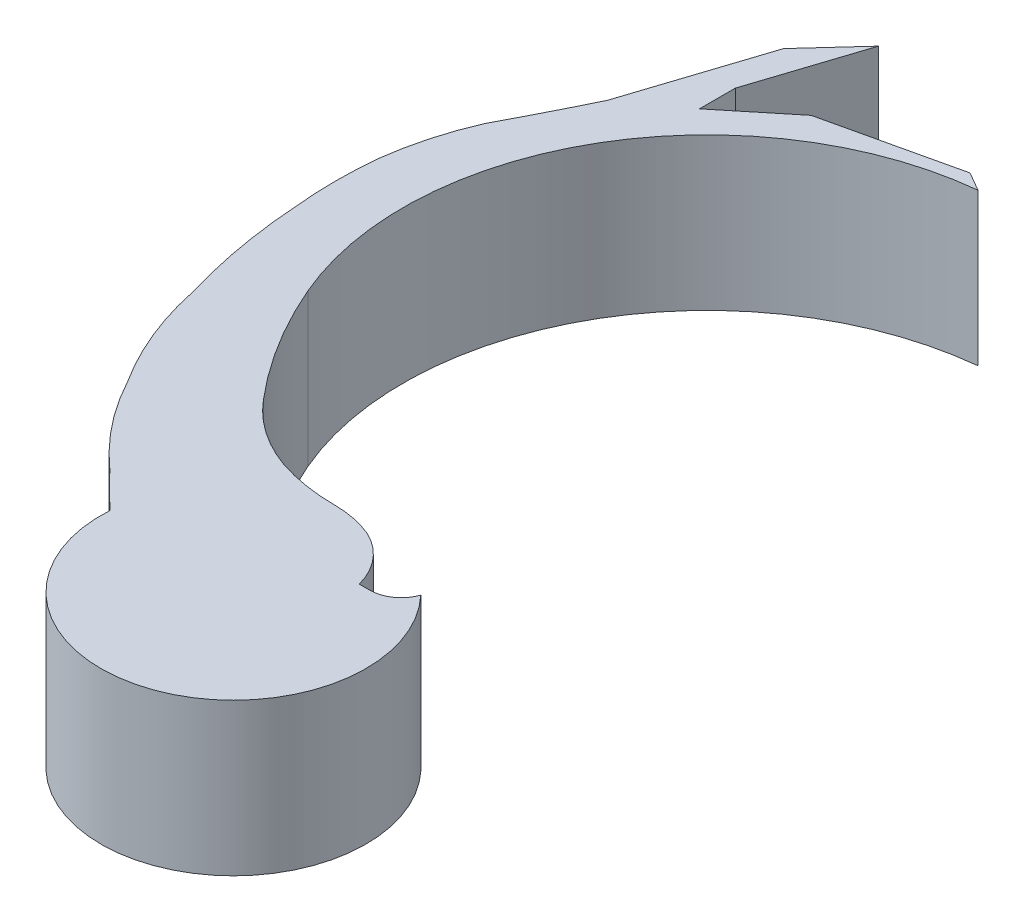
ISO-10303-21;
HEADER;
FILE_DESCRIPTION(('STEP AP214'),'2;1');
FILE_NAME('part.step','',(''),(''),'','','');
FILE_SCHEMA(('AUTOMOTIVE_DESIGN { 1 0 10303 214 1 1 1 1 }'));
ENDSEC;
DATA;
#1=APPLICATION_CONTEXT('core data for automotive mechanical design processes');
#2=APPLICATION_PROTOCOL_DEFINITION('international standard','automotive_design',2000,#1);
#3=PRODUCT_CONTEXT('',#1,'mechanical');
#4=PRODUCT('Part','Part','',(#3));
#5=PRODUCT_RELATED_PRODUCT_CATEGORY('part','',(#4));
#6=PRODUCT_DEFINITION_FORMATION('','',#4);
#7=PRODUCT_DEFINITION_CONTEXT('part definition',#1,'design');
#8=PRODUCT_DEFINITION('design','',#6,#7);
#9=PRODUCT_DEFINITION_SHAPE('','',#8);
#10=(LENGTH_UNIT() NAMED_UNIT(*) SI_UNIT(.MILLI.,.METRE.));
#11=(NAMED_UNIT(*) PLANE_ANGLE_UNIT() SI_UNIT($,.RADIAN.));
#12=(NAMED_UNIT(*) SI_UNIT($,.STERADIAN.) SOLID_ANGLE_UNIT());
#13=UNCERTAINTY_MEASURE_WITH_UNIT(LENGTH_MEASURE(1.E-05),#10,'distance_accuracy_value','');
#14=(GEOMETRIC_REPRESENTATION_CONTEXT(3) GLOBAL_UNCERTAINTY_ASSIGNED_CONTEXT((#13)) GLOBAL_UNIT_ASSIGNED_CONTEXT((#10,
#11,#12)) REPRESENTATION_CONTEXT('',''));
#15=CARTESIAN_POINT('',(0.,0.,0.));
#16=DIRECTION('',(0.,0.,1.));
#17=DIRECTION('',(1.,0.,0.));
#18=AXIS2_PLACEMENT_3D('',#15,#16,#17);
#19=CARTESIAN_POINT('',(-20.2142413349629,10.,0.));
#20=DIRECTION('',(1.,0.,0.));
#21=DIRECTION('',(0.,0.,-1.));
#22=AXIS2_PLACEMENT_3D('',#19,#20,#21);
#23=PLANE('',#22);
#24=DIRECTION('',(0.,0.,1.));
#25=VECTOR('',#24,1.);
#26=CARTESIAN_POINT('',(-20.2142413349629,0.,0.));
#27=LINE('',#26,#25);
#28=CARTESIAN_POINT('',(-20.2142413349629,0.,-18.5820088699334));
#29=VERTEX_POINT('',#28);
#30=CARTESIAN_POINT('',(-20.2142413349629,0.,-16.2231725935429));
#31=VERTEX_POINT('',#30);
#32=EDGE_CURVE('E216',#29,#31,#27,.T.);
#33=ORIENTED_EDGE('',*,*,#32,.F.);
#34=DIRECTION('',(0.,-1.,0.));
#35=VECTOR('',#34,1.);
#36=CARTESIAN_POINT('',(-20.2142413349629,10.,-18.5820088699334));
#37=LINE('',#36,#35);
#38=CARTESIAN_POINT('',(-20.2142413349629,10.,-18.5820088699334));
#39=VERTEX_POINT('',#38);
#40=EDGE_CURVE('E11',#39,#29,#37,.T.);
#41=ORIENTED_EDGE('',*,*,#40,.F.);
#42=DIRECTION('',(0.,0.,1.));
#43=VECTOR('',#42,1.);
#44=CARTESIAN_POINT('',(-20.2142413349629,10.,0.));
#45=LINE('',#44,#43);
#46=CARTESIAN_POINT('',(-20.2142413349629,10.,-16.2231725935429));
#47=VERTEX_POINT('',#46);
#48=EDGE_CURVE('E267',#39,#47,#45,.T.);
#49=ORIENTED_EDGE('',*,*,#48,.T.);
#50=DIRECTION('',(0.,-1.,0.));
#51=VECTOR('',#50,1.);
#52=CARTESIAN_POINT('',(-20.2142413349629,10.,-16.2231725935429));
#53=LINE('',#52,#51);
#54=EDGE_CURVE('E129',#47,#31,#53,.T.);
#55=ORIENTED_EDGE('',*,*,#54,.T.);
#56=EDGE_LOOP('',(#33,#41,#49,#55));
#57=FACE_BOUND('',#56,.T.);
#58=ADVANCED_FACE('F34',(#57),#23,.T.);
#59=CARTESIAN_POINT('',(-23.7471866779469,10.,-7.73368275087385));
#60=DIRECTION('',(0.9508473764207,0.,0.30965992112941));
#61=DIRECTION('',(0.30965992112941,0.,-0.9508473764207));
#62=AXIS2_PLACEMENT_3D('',#59,#60,#61);
#63=PLANE('',#62);
#64=DIRECTION('',(-0.30965992112941,0.,0.9508473764207));
#65=VECTOR('',#64,1.);
#66=CARTESIAN_POINT('',(-23.7471866779469,0.,-7.73368275087385));
#67=LINE('',#66,#65);
#68=CARTESIAN_POINT('',(-17.9037086364288,0.,-25.676772527182));
#69=VERTEX_POINT('',#68);
#70=EDGE_CURVE('E219',#69,#29,#67,.T.);
#71=ORIENTED_EDGE('',*,*,#70,.F.);
#72=DIRECTION('',(0.,-1.,0.));
#73=VECTOR('',#72,1.);
#74=CARTESIAN_POINT('',(-17.9037086364288,10.,-25.676772527182));
#75=LINE('',#74,#73);
#76=CARTESIAN_POINT('',(-17.9037086364288,10.,-25.676772527182));
#77=VERTEX_POINT('',#76);
#78=EDGE_CURVE('E42',#77,#69,#75,.T.);
#79=ORIENTED_EDGE('',*,*,#78,.F.);
#80=DIRECTION('',(-0.30965992112941,0.,0.9508473764207));
#81=VECTOR('',#80,1.);
#82=CARTESIAN_POINT('',(-23.7471866779469,10.,-7.73368275087385));
#83=LINE('',#82,#81);
#84=EDGE_CURVE('E333',#77,#39,#83,.T.);
#85=ORIENTED_EDGE('',*,*,#84,.T.);
#86=ORIENTED_EDGE('',*,*,#40,.T.);
#87=EDGE_LOOP('',(#71,#79,#85,#86));
#88=FACE_BOUND('',#87,.T.);
#89=ADVANCED_FACE('F332',(#88),#63,.T.);
#90=CARTESIAN_POINT('',(-22.5451132045827,10.,-20.5961675466554));
#91=DIRECTION('',(0.738297960081065,0.,0.674474700889617));
#92=DIRECTION('',(0.674474700889617,0.,-0.738297960081065));
#93=AXIS2_PLACEMENT_3D('',#90,#91,#92);
#94=PLANE('',#93);
#95=DIRECTION('',(-0.674474700889617,0.,0.738297960081065));
#96=VECTOR('',#95,1.);
#97=CARTESIAN_POINT('',(-22.5451132045827,0.,-20.5961675466554));
#98=LINE('',#97,#96);
#99=CARTESIAN_POINT('',(-20.8793273548735,0.,-22.4195810759546));
#100=VERTEX_POINT('',#99);
#101=EDGE_CURVE('E222',#69,#100,#98,.T.);
#102=ORIENTED_EDGE('',*,*,#101,.T.);
#103=DIRECTION('',(0.,-1.,0.));
#104=VECTOR('',#103,1.);
#105=CARTESIAN_POINT('',(-20.8793273548735,10.,-22.4195810759546));
#106=LINE('',#105,#104);
#107=CARTESIAN_POINT('',(-20.8793273548735,10.,-22.4195810759546));
#108=VERTEX_POINT('',#107);
#109=EDGE_CURVE('E316',#108,#100,#106,.T.);
#110=ORIENTED_EDGE('',*,*,#109,.F.);
#111=DIRECTION('',(-0.674474700889617,0.,0.738297960081065));
#112=VECTOR('',#111,1.);
#113=CARTESIAN_POINT('',(-22.5451132045827,10.,-20.5961675466554));
#114=LINE('',#113,#112);
#115=EDGE_CURVE('E323',#77,#108,#114,.T.);
#116=ORIENTED_EDGE('',*,*,#115,.F.);
#117=ORIENTED_EDGE('',*,*,#78,.T.);
#118=EDGE_LOOP('',(#102,#110,#116,#117));
#119=FACE_BOUND('',#118,.T.);
#120=ADVANCED_FACE('F321',(#119),#94,.F.);
#121=CARTESIAN_POINT('',(-25.4784302516431,10.,-8.29749221365493));
#122=DIRECTION('',(0.9508473764207,0.,0.309659921129409));
#123=DIRECTION('',(0.309659921129409,0.,-0.9508473764207));
#124=AXIS2_PLACEMENT_3D('',#121,#122,#123);
#125=PLANE('',#124);
#126=DIRECTION('',(-0.309659921129409,0.,0.9508473764207));
#127=VECTOR('',#126,1.);
#128=CARTESIAN_POINT('',(-25.4784302516431,0.,-8.29749221365493));
#129=LINE('',#128,#127);
#130=CARTESIAN_POINT('',(-23.7260144435207,0.,-13.678492013287));
#131=VERTEX_POINT('',#130);
#132=EDGE_CURVE('E224',#100,#131,#129,.T.);
#133=ORIENTED_EDGE('',*,*,#132,.T.);
#134=DIRECTION('',(0.,-1.,0.));
#135=VECTOR('',#134,1.);
#136=CARTESIAN_POINT('',(-23.7260144435207,10.,-13.678492013287));
#137=LINE('',#136,#135);
#138=CARTESIAN_POINT('',(-23.7260144435207,10.,-13.678492013287));
#139=VERTEX_POINT('',#138);
#140=EDGE_CURVE('E313',#139,#131,#137,.T.);
#141=ORIENTED_EDGE('',*,*,#140,.F.);
#142=DIRECTION('',(-0.309659921129409,0.,0.9508473764207));
#143=VECTOR('',#142,1.);
#144=CARTESIAN_POINT('',(-25.4784302516431,10.,-8.29749221365493));
#145=LINE('',#144,#143);
#146=EDGE_CURVE('E339',#108,#139,#145,.T.);
#147=ORIENTED_EDGE('',*,*,#146,.F.);
#148=ORIENTED_EDGE('',*,*,#109,.T.);
#149=EDGE_LOOP('',(#133,#141,#147,#148));
#150=FACE_BOUND('',#149,.T.);
#151=ADVANCED_FACE('F449',(#150),#125,.F.);
#152=CARTESIAN_POINT('',(-176.392216070516,10.,-87.6034124748396));
#153=DIRECTION('',(0.,-1.,0.));
#154=DIRECTION('',(0.,0.,-1.));
#155=AXIS2_PLACEMENT_3D('',#152,#153,#154);
#156=CYLINDRICAL_SURFACE('',#155,169.622707750057);
#157=CARTESIAN_POINT('',(-176.392216070516,0.,-87.6034124748396));
#158=DIRECTION('',(0.,1.,0.));
#159=DIRECTION('',(0.,0.,1.));
#160=AXIS2_PLACEMENT_3D('',#157,#158,#159);
#161=CIRCLE('',#160,169.622707750057);
#162=CARTESIAN_POINT('',(-26.4444092567069,0.,-8.30953997393402));
#163=VERTEX_POINT('',#162);
#164=EDGE_CURVE('E226',#131,#163,#161,.F.);
#165=ORIENTED_EDGE('',*,*,#164,.T.);
#166=DIRECTION('',(0.,-1.,0.));
#167=VECTOR('',#166,1.);
#168=CARTESIAN_POINT('',(-26.4444092567069,10.,-8.30953997393402));
#169=LINE('',#168,#167);
#170=CARTESIAN_POINT('',(-26.4444092567069,10.,-8.30953997393402));
#171=VERTEX_POINT('',#170);
#172=EDGE_CURVE('E310',#171,#163,#169,.T.);
#173=ORIENTED_EDGE('',*,*,#172,.F.);
#174=CARTESIAN_POINT('',(-176.392216070516,10.,-87.6034124748396));
#175=DIRECTION('',(0.,1.,0.));
#176=DIRECTION('',(0.,0.,1.));
#177=AXIS2_PLACEMENT_3D('',#174,#175,#176);
#178=CIRCLE('',#177,169.622707750057);
#179=EDGE_CURVE('E341',#139,#171,#178,.F.);
#180=ORIENTED_EDGE('',*,*,#179,.F.);
#181=ORIENTED_EDGE('',*,*,#140,.T.);
#182=EDGE_LOOP('',(#165,#173,#180,#181));
#183=FACE_BOUND('',#182,.T.);
#184=ADVANCED_FACE('F445',(#183),#156,.F.);
#185=CARTESIAN_POINT('',(-7.95665330887578,10.,-0.323804662988942));
#186=DIRECTION('',(0.,-1.,0.));
#187=DIRECTION('',(0.,0.,-1.));
#188=AXIS2_PLACEMENT_3D('',#185,#186,#187);
#189=CYLINDRICAL_SURFACE('',#188,20.1387459501092);
#190=CARTESIAN_POINT('',(-7.95665330887578,0.,-0.323804662988942));
#191=DIRECTION('',(0.,1.,0.));
#192=DIRECTION('',(0.,0.,1.));
#193=AXIS2_PLACEMENT_3D('',#190,#191,#192);
#194=CIRCLE('',#193,20.1387459501092);
#195=CARTESIAN_POINT('',(-27.9369455661077,0.,-2.84511578195853));
#196=VERTEX_POINT('',#195);
#197=EDGE_CURVE('E228',#163,#196,#194,.T.);
#198=ORIENTED_EDGE('',*,*,#197,.T.);
#199=DIRECTION('',(0.,-1.,0.));
#200=VECTOR('',#199,1.);
#201=CARTESIAN_POINT('',(-27.9369455661077,10.,-2.84511578195853));
#202=LINE('',#201,#200);
#203=CARTESIAN_POINT('',(-27.9369455661077,10.,-2.84511578195853));
#204=VERTEX_POINT('',#203);
#205=EDGE_CURVE('E307',#204,#196,#202,.T.);
#206=ORIENTED_EDGE('',*,*,#205,.F.);
#207=CARTESIAN_POINT('',(-7.95665330887578,10.,-0.323804662988942));
#208=DIRECTION('',(0.,1.,0.));
#209=DIRECTION('',(0.,0.,1.));
#210=AXIS2_PLACEMENT_3D('',#207,#208,#209);
#211=CIRCLE('',#210,20.1387459501092);
#212=EDGE_CURVE('E343',#171,#204,#211,.T.);
#213=ORIENTED_EDGE('',*,*,#212,.F.);
#214=ORIENTED_EDGE('',*,*,#172,.T.);
#215=EDGE_LOOP('',(#198,#206,#213,#214));
#216=FACE_BOUND('',#215,.T.);
#217=ADVANCED_FACE('F440',(#216),#189,.T.);
#218=CARTESIAN_POINT('',(-0.916574408994741,10.,-0.180490640112039));
#219=DIRECTION('',(0.,-1.,0.));
#220=DIRECTION('',(0.,0.,-1.));
#221=AXIS2_PLACEMENT_3D('',#218,#219,#220);
#222=CYLINDRICAL_SURFACE('',#221,27.1514398258122);
#223=CARTESIAN_POINT('',(-0.916574408994741,0.,-0.180490640112039));
#224=DIRECTION('',(0.,1.,0.));
#225=DIRECTION('',(0.,0.,1.));
#226=AXIS2_PLACEMENT_3D('',#223,#224,#225);
#227=CIRCLE('',#226,27.1514398258122);
#228=CARTESIAN_POINT('',(-27.9369455661077,0.,2.48413450173445));
#229=VERTEX_POINT('',#228);
#230=EDGE_CURVE('E230',#196,#229,#227,.T.);
#231=ORIENTED_EDGE('',*,*,#230,.T.);
#232=DIRECTION('',(0.,-1.,0.));
#233=VECTOR('',#232,1.);
#234=CARTESIAN_POINT('',(-27.9369455661077,10.,2.48413450173445));
#235=LINE('',#234,#233);
#236=CARTESIAN_POINT('',(-27.9369455661077,10.,2.48413450173445));
#237=VERTEX_POINT('',#236);
#238=EDGE_CURVE('E304',#237,#229,#235,.T.);
#239=ORIENTED_EDGE('',*,*,#238,.F.);
#240=CARTESIAN_POINT('',(-0.916574408994741,10.,-0.180490640112039));
#241=DIRECTION('',(0.,1.,0.));
#242=DIRECTION('',(0.,0.,1.));
#243=AXIS2_PLACEMENT_3D('',#240,#241,#242);
#244=CIRCLE('',#243,27.1514398258122);
#245=EDGE_CURVE('E345',#204,#237,#244,.T.);
#246=ORIENTED_EDGE('',*,*,#245,.F.);
#247=ORIENTED_EDGE('',*,*,#205,.T.);
#248=EDGE_LOOP('',(#231,#239,#246,#247));
#249=FACE_BOUND('',#248,.T.);
#250=ADVANCED_FACE('F436',(#249),#222,.T.);
#251=CARTESIAN_POINT('',(10.0269760816482,10.,0.0435951776764512));
#252=DIRECTION('',(0.,-1.,0.));
#253=DIRECTION('',(0.,0.,-1.));
#254=AXIS2_PLACEMENT_3D('',#251,#252,#253);
#255=CYLINDRICAL_SURFACE('',#254,38.0422867223991);
#256=CARTESIAN_POINT('',(10.0269760816482,0.,0.0435951776764512));
#257=DIRECTION('',(0.,1.,0.));
#258=DIRECTION('',(0.,0.,1.));
#259=AXIS2_PLACEMENT_3D('',#256,#257,#258);
#260=CIRCLE('',#259,38.0422867223991);
#261=CARTESIAN_POINT('',(-26.4444092567069,0.,10.8627277940389));
#262=VERTEX_POINT('',#261);
#263=EDGE_CURVE('E232',#229,#262,#260,.T.);
#264=ORIENTED_EDGE('',*,*,#263,.T.);
#265=DIRECTION('',(0.,-1.,0.));
#266=VECTOR('',#265,1.);
#267=CARTESIAN_POINT('',(-26.4444092567069,10.,10.8627277940389));
#268=LINE('',#267,#266);
#269=CARTESIAN_POINT('',(-26.4444092567069,10.,10.8627277940389));
#270=VERTEX_POINT('',#269);
#271=EDGE_CURVE('E301',#270,#262,#268,.T.);
#272=ORIENTED_EDGE('',*,*,#271,.F.);
#273=CARTESIAN_POINT('',(10.0269760816482,10.,0.0435951776764512));
#274=DIRECTION('',(0.,1.,0.));
#275=DIRECTION('',(0.,0.,1.));
#276=AXIS2_PLACEMENT_3D('',#273,#274,#275);
#277=CIRCLE('',#276,38.0422867223991);
#278=EDGE_CURVE('E347',#237,#270,#277,.T.);
#279=ORIENTED_EDGE('',*,*,#278,.F.);
#280=ORIENTED_EDGE('',*,*,#238,.T.);
#281=EDGE_LOOP('',(#264,#272,#279,#280));
#282=FACE_BOUND('',#281,.T.);
#283=ADVANCED_FACE('F432',(#282),#255,.T.);
#284=CARTESIAN_POINT('',(-5.33895266715763,10.,6.45705183034006));
#285=DIRECTION('',(0.,-1.,0.));
#286=DIRECTION('',(0.,0.,-1.));
#287=AXIS2_PLACEMENT_3D('',#284,#285,#286);
#288=CYLINDRICAL_SURFACE('',#287,21.5603867903724);
#289=CARTESIAN_POINT('',(-5.33895266715763,0.,6.45705183034006));
#290=DIRECTION('',(0.,1.,0.));
#291=DIRECTION('',(0.,0.,1.));
#292=AXIS2_PLACEMENT_3D('',#289,#290,#291);
#293=CIRCLE('',#292,21.5603867903724);
#294=CARTESIAN_POINT('',(-23.4883748387578,0.,18.0952971185049));
#295=VERTEX_POINT('',#294);
#296=EDGE_CURVE('E234',#262,#295,#293,.T.);
#297=ORIENTED_EDGE('',*,*,#296,.T.);
#298=DIRECTION('',(0.,-1.,0.));
#299=VECTOR('',#298,1.);
#300=CARTESIAN_POINT('',(-23.4883748387578,10.,18.0952971185049));
#301=LINE('',#300,#299);
#302=CARTESIAN_POINT('',(-23.4883748387578,10.,18.0952971185049));
#303=VERTEX_POINT('',#302);
#304=EDGE_CURVE('E298',#303,#295,#301,.T.);
#305=ORIENTED_EDGE('',*,*,#304,.F.);
#306=CARTESIAN_POINT('',(-5.33895266715763,10.,6.45705183034006));
#307=DIRECTION('',(0.,1.,0.));
#308=DIRECTION('',(0.,0.,1.));
#309=AXIS2_PLACEMENT_3D('',#306,#307,#308);
#310=CIRCLE('',#309,21.5603867903724);
#311=EDGE_CURVE('E349',#270,#303,#310,.T.);
#312=ORIENTED_EDGE('',*,*,#311,.F.);
#313=ORIENTED_EDGE('',*,*,#271,.T.);
#314=EDGE_LOOP('',(#297,#305,#312,#313));
#315=FACE_BOUND('',#314,.T.);
#316=ADVANCED_FACE('F427',(#315),#288,.T.);
#317=CARTESIAN_POINT('',(-5.56875548128325,10.,8.49444290633343));
#318=DIRECTION('',(0.,-1.,0.));
#319=DIRECTION('',(0.,0.,-1.));
#320=AXIS2_PLACEMENT_3D('',#317,#318,#319);
#321=CYLINDRICAL_SURFACE('',#320,20.3295144929766);
#322=CARTESIAN_POINT('',(-5.56875548128325,0.,8.49444290633343));
#323=DIRECTION('',(0.,1.,0.));
#324=DIRECTION('',(0.,0.,1.));
#325=AXIS2_PLACEMENT_3D('',#322,#323,#324);
#326=CIRCLE('',#325,20.3295144929766);
#327=CARTESIAN_POINT('',(-19.0281085745464,0.,23.7304192068865));
#328=VERTEX_POINT('',#327);
#329=EDGE_CURVE('E236',#295,#328,#326,.T.);
#330=ORIENTED_EDGE('',*,*,#329,.T.);
#331=DIRECTION('',(0.,-1.,0.));
#332=VECTOR('',#331,1.);
#333=CARTESIAN_POINT('',(-19.0281085745464,10.,23.7304192068865));
#334=LINE('',#333,#332);
#335=CARTESIAN_POINT('',(-19.0281085745464,10.,23.7304192068865));
#336=VERTEX_POINT('',#335);
#337=EDGE_CURVE('E295',#336,#328,#334,.T.);
#338=ORIENTED_EDGE('',*,*,#337,.F.);
#339=CARTESIAN_POINT('',(-5.56875548128325,10.,8.49444290633343));
#340=DIRECTION('',(0.,1.,0.));
#341=DIRECTION('',(0.,0.,1.));
#342=AXIS2_PLACEMENT_3D('',#339,#340,#341);
#343=CIRCLE('',#342,20.3295144929766);
#344=EDGE_CURVE('E351',#303,#336,#343,.T.);
#345=ORIENTED_EDGE('',*,*,#344,.F.);
#346=ORIENTED_EDGE('',*,*,#304,.T.);
#347=EDGE_LOOP('',(#330,#338,#345,#346));
#348=FACE_BOUND('',#347,.T.);
#349=ADVANCED_FACE('F421',(#348),#321,.T.);
#350=CARTESIAN_POINT('',(23.0713592637592,10.,-16.3305079808861));
#351=DIRECTION('',(0.,-1.,0.));
#352=DIRECTION('',(0.,0.,-1.));
#353=AXIS2_PLACEMENT_3D('',#350,#351,#352);
#354=CYLINDRICAL_SURFACE('',#353,58.1140523403122);
#355=CARTESIAN_POINT('',(23.0713592637592,0.,-16.3305079808861));
#356=DIRECTION('',(0.,1.,0.));
#357=DIRECTION('',(0.,0.,1.));
#358=AXIS2_PLACEMENT_3D('',#355,#356,#357);
#359=CIRCLE('',#358,58.1140523403122);
#360=CARTESIAN_POINT('',(-16.7188963438803,0.,26.0248770143097));
#361=VERTEX_POINT('',#360);
#362=EDGE_CURVE('E238',#328,#361,#359,.T.);
#363=ORIENTED_EDGE('',*,*,#362,.T.);
#364=DIRECTION('',(0.,-1.,0.));
#365=VECTOR('',#364,1.);
#366=CARTESIAN_POINT('',(-16.7188963438803,10.,26.0248770143097));
#367=LINE('',#366,#365);
#368=CARTESIAN_POINT('',(-16.7188963438803,10.,26.0248770143097));
#369=VERTEX_POINT('',#368);
#370=EDGE_CURVE('E292',#369,#361,#367,.T.);
#371=ORIENTED_EDGE('',*,*,#370,.F.);
#372=CARTESIAN_POINT('',(23.0713592637592,10.,-16.3305079808861));
#373=DIRECTION('',(0.,1.,0.));
#374=DIRECTION('',(0.,0.,1.));
#375=AXIS2_PLACEMENT_3D('',#372,#373,#374);
#376=CIRCLE('',#375,58.1140523403122);
#377=EDGE_CURVE('E353',#336,#369,#376,.T.);
#378=ORIENTED_EDGE('',*,*,#377,.F.);
#379=ORIENTED_EDGE('',*,*,#337,.T.);
#380=EDGE_LOOP('',(#363,#371,#378,#379));
#381=FACE_BOUND('',#380,.T.);
#382=ADVANCED_FACE('F417',(#381),#354,.T.);
#383=CARTESIAN_POINT('',(-8.02083751157961,10.,26.6117701255922));
#384=DIRECTION('',(0.,-1.,0.));
#385=DIRECTION('',(0.,0.,-1.));
#386=AXIS2_PLACEMENT_3D('',#383,#384,#385);
#387=CYLINDRICAL_SURFACE('',#386,8.71783637000804);
#388=CARTESIAN_POINT('',(-8.02083751157961,0.,26.6117701255922));
#389=DIRECTION('',(0.,1.,0.));
#390=DIRECTION('',(0.,0.,1.));
#391=AXIS2_PLACEMENT_3D('',#388,#389,#390);
#392=CIRCLE('',#391,8.71783637000804);
#393=CARTESIAN_POINT('',(-1.68257798066413,0.,20.6261927020687));
#394=VERTEX_POINT('',#393);
#395=EDGE_CURVE('E240',#361,#394,#392,.T.);
#396=ORIENTED_EDGE('',*,*,#395,.T.);
#397=DIRECTION('',(0.,-1.,0.));
#398=VECTOR('',#397,1.);
#399=CARTESIAN_POINT('',(-1.68257798066413,10.,20.6261927020687));
#400=LINE('',#399,#398);
#401=CARTESIAN_POINT('',(-1.68257798066413,10.,20.6261927020687));
#402=VERTEX_POINT('',#401);
#403=EDGE_CURVE('E290',#402,#394,#400,.T.);
#404=ORIENTED_EDGE('',*,*,#403,.F.);
#405=CARTESIAN_POINT('',(-8.02083751157961,10.,26.6117701255922));
#406=DIRECTION('',(0.,1.,0.));
#407=DIRECTION('',(0.,0.,1.));
#408=AXIS2_PLACEMENT_3D('',#405,#406,#407);
#409=CIRCLE('',#408,8.71783637000804);
#410=EDGE_CURVE('E355',#369,#402,#409,.T.);
#411=ORIENTED_EDGE('',*,*,#410,.F.);
#412=ORIENTED_EDGE('',*,*,#370,.T.);
#413=EDGE_LOOP('',(#396,#404,#411,#412));
#414=FACE_BOUND('',#413,.T.);
#415=ADVANCED_FACE('F412',(#414),#387,.T.);
#416=CARTESIAN_POINT('',(-3.64579816787088,10.,19.9478915167739));
#417=DIRECTION('',(0.,-1.,0.));
#418=DIRECTION('',(0.,0.,-1.));
#419=AXIS2_PLACEMENT_3D('',#416,#417,#418);
#420=CYLINDRICAL_SURFACE('',#419,2.07709556867959);
#421=CARTESIAN_POINT('',(-3.64579816787088,0.,19.9478915167739));
#422=DIRECTION('',(0.,1.,0.));
#423=DIRECTION('',(0.,0.,1.));
#424=AXIS2_PLACEMENT_3D('',#421,#422,#423);
#425=CIRCLE('',#424,2.07709556867959);
#426=CARTESIAN_POINT('',(-3.64579816787088,0.,22.0249870854535));
#427=VERTEX_POINT('',#426);
#428=EDGE_CURVE('E243',#427,#394,#425,.T.);
#429=ORIENTED_EDGE('',*,*,#428,.F.);
#430=DIRECTION('',(0.,-1.,0.));
#431=VECTOR('',#430,1.);
#432=CARTESIAN_POINT('',(-3.64579816787088,10.,22.0249870854535));
#433=LINE('',#432,#431);
#434=CARTESIAN_POINT('',(-3.64579816787088,10.,22.0249870854535));
#435=VERTEX_POINT('',#434);
#436=EDGE_CURVE('E288',#435,#427,#433,.T.);
#437=ORIENTED_EDGE('',*,*,#436,.F.);
#438=CARTESIAN_POINT('',(-3.64579816787088,10.,19.9478915167739));
#439=DIRECTION('',(0.,1.,0.));
#440=DIRECTION('',(0.,0.,1.));
#441=AXIS2_PLACEMENT_3D('',#438,#439,#440);
#442=CIRCLE('',#441,2.07709556867959);
#443=EDGE_CURVE('E357',#435,#402,#442,.T.);
#444=ORIENTED_EDGE('',*,*,#443,.T.);
#445=ORIENTED_EDGE('',*,*,#403,.T.);
#446=EDGE_LOOP('',(#429,#437,#444,#445));
#447=FACE_BOUND('',#446,.T.);
#448=ADVANCED_FACE('F406',(#447),#420,.F.);
#449=CARTESIAN_POINT('',(0.,10.,22.0249870854535));
#450=DIRECTION('',(0.,0.,-1.));
#451=DIRECTION('',(-1.,0.,0.));
#452=AXIS2_PLACEMENT_3D('',#449,#450,#451);
#453=PLANE('',#452);
#454=DIRECTION('',(1.,0.,0.));
#455=VECTOR('',#454,1.);
#456=CARTESIAN_POINT('',(0.,0.,22.0249870854535));
#457=LINE('',#456,#455);
#458=CARTESIAN_POINT('',(-4.33019955839973,0.,22.0249870854535));
#459=VERTEX_POINT('',#458);
#460=EDGE_CURVE('E246',#459,#427,#457,.T.);
#461=ORIENTED_EDGE('',*,*,#460,.F.);
#462=DIRECTION('',(0.,-1.,0.));
#463=VECTOR('',#462,1.);
#464=CARTESIAN_POINT('',(-4.33019955839973,10.,22.0249870854535));
#465=LINE('',#464,#463);
#466=CARTESIAN_POINT('',(-4.33019955839973,10.,22.0249870854535));
#467=VERTEX_POINT('',#466);
#468=EDGE_CURVE('E286',#467,#459,#465,.T.);
#469=ORIENTED_EDGE('',*,*,#468,.F.);
#470=DIRECTION('',(1.,0.,0.));
#471=VECTOR('',#470,1.);
#472=CARTESIAN_POINT('',(0.,10.,22.0249870854535));
#473=LINE('',#472,#471);
#474=EDGE_CURVE('E360',#467,#435,#473,.T.);
#475=ORIENTED_EDGE('',*,*,#474,.T.);
#476=ORIENTED_EDGE('',*,*,#436,.T.);
#477=EDGE_LOOP('',(#461,#469,#475,#476));
#478=FACE_BOUND('',#477,.T.);
#479=ADVANCED_FACE('F400',(#478),#453,.T.);
#480=CARTESIAN_POINT('',(-9.04253642160193,10.,23.2869671122719));
#481=DIRECTION('',(0.,-1.,0.));
#482=DIRECTION('',(0.,0.,-1.));
#483=AXIS2_PLACEMENT_3D('',#480,#481,#482);
#484=CYLINDRICAL_SURFACE('',#483,4.8783923889313);
#485=CARTESIAN_POINT('',(-9.04253642160193,0.,23.2869671122719));
#486=DIRECTION('',(0.,1.,0.));
#487=DIRECTION('',(0.,0.,1.));
#488=AXIS2_PLACEMENT_3D('',#485,#486,#487);
#489=CIRCLE('',#488,4.8783923889313);
#490=CARTESIAN_POINT('',(-6.95849038282123,0.,18.8761322243368));
#491=VERTEX_POINT('',#490);
#492=EDGE_CURVE('E249',#459,#491,#489,.T.);
#493=ORIENTED_EDGE('',*,*,#492,.T.);
#494=DIRECTION('',(0.,-1.,0.));
#495=VECTOR('',#494,1.);
#496=CARTESIAN_POINT('',(-6.95849038282123,10.,18.8761322243368));
#497=LINE('',#496,#495);
#498=CARTESIAN_POINT('',(-6.95849038282123,10.,18.8761322243368));
#499=VERTEX_POINT('',#498);
#500=EDGE_CURVE('E283',#499,#491,#497,.T.);
#501=ORIENTED_EDGE('',*,*,#500,.F.);
#502=CARTESIAN_POINT('',(-9.04253642160193,10.,23.2869671122719));
#503=DIRECTION('',(0.,1.,0.));
#504=DIRECTION('',(0.,0.,1.));
#505=AXIS2_PLACEMENT_3D('',#502,#503,#504);
#506=CIRCLE('',#505,4.8783923889313);
#507=EDGE_CURVE('E363',#467,#499,#506,.T.);
#508=ORIENTED_EDGE('',*,*,#507,.F.);
#509=ORIENTED_EDGE('',*,*,#468,.T.);
#510=EDGE_LOOP('',(#493,#501,#508,#509));
#511=FACE_BOUND('',#510,.T.);
#512=ADVANCED_FACE('F450',(#511),#484,.T.);
#513=CARTESIAN_POINT('',(-9.68977642554818,10.,25.4216520417061));
#514=DIRECTION('',(0.,-1.,0.));
#515=DIRECTION('',(0.,0.,-1.));
#516=AXIS2_PLACEMENT_3D('',#513,#514,#515);
#517=CYLINDRICAL_SURFACE('',#516,7.09251387920879);
#518=CARTESIAN_POINT('',(-9.68977642554818,0.,25.4216520417061));
#519=DIRECTION('',(0.,1.,0.));
#520=DIRECTION('',(0.,0.,1.));
#521=AXIS2_PLACEMENT_3D('',#518,#519,#520);
#522=CIRCLE('',#521,7.09251387920879);
#523=CARTESIAN_POINT('',(-9.67568618032591,0.,18.3291521586071));
#524=VERTEX_POINT('',#523);
#525=EDGE_CURVE('E251',#491,#524,#522,.T.);
#526=ORIENTED_EDGE('',*,*,#525,.T.);
#527=DIRECTION('',(0.,-1.,0.));
#528=VECTOR('',#527,1.);
#529=CARTESIAN_POINT('',(-9.67568618032591,10.,18.3291521586071));
#530=LINE('',#529,#528);
#531=CARTESIAN_POINT('',(-9.67568618032591,10.,18.3291521586071));
#532=VERTEX_POINT('',#531);
#533=EDGE_CURVE('E280',#532,#524,#530,.T.);
#534=ORIENTED_EDGE('',*,*,#533,.F.);
#535=CARTESIAN_POINT('',(-9.68977642554818,10.,25.4216520417061));
#536=DIRECTION('',(0.,1.,0.));
#537=DIRECTION('',(0.,0.,1.));
#538=AXIS2_PLACEMENT_3D('',#535,#536,#537);
#539=CIRCLE('',#538,7.09251387920879);
#540=EDGE_CURVE('E365',#499,#532,#539,.T.);
#541=ORIENTED_EDGE('',*,*,#540,.F.);
#542=ORIENTED_EDGE('',*,*,#500,.T.);
#543=EDGE_LOOP('',(#526,#534,#541,#542));
#544=FACE_BOUND('',#543,.T.);
#545=ADVANCED_FACE('F394',(#544),#517,.T.);
#546=CARTESIAN_POINT('',(-9.65043153925733,10.,5.6169150043886));
#547=DIRECTION('',(0.,-1.,0.));
#548=DIRECTION('',(0.,0.,-1.));
#549=AXIS2_PLACEMENT_3D('',#546,#547,#548);
#550=CYLINDRICAL_SURFACE('',#549,12.7122622401361);
#551=CARTESIAN_POINT('',(-9.65043153925733,0.,5.6169150043886));
#552=DIRECTION('',(0.,1.,0.));
#553=DIRECTION('',(0.,0.,1.));
#554=AXIS2_PLACEMENT_3D('',#551,#552,#553);
#555=CIRCLE('',#554,12.7122622401361);
#556=CARTESIAN_POINT('',(-13.5956173911468,0.,17.7014969109355));
#557=VERTEX_POINT('',#556);
#558=EDGE_CURVE('E253',#524,#557,#555,.F.);
#559=ORIENTED_EDGE('',*,*,#558,.T.);
#560=DIRECTION('',(0.,-1.,0.));
#561=VECTOR('',#560,1.);
#562=CARTESIAN_POINT('',(-13.5956173911468,10.,17.7014969109355));
#563=LINE('',#562,#561);
#564=CARTESIAN_POINT('',(-13.5956173911468,10.,17.7014969109355));
#565=VERTEX_POINT('',#564);
#566=EDGE_CURVE('E277',#565,#557,#563,.T.);
#567=ORIENTED_EDGE('',*,*,#566,.F.);
#568=CARTESIAN_POINT('',(-9.65043153925733,10.,5.6169150043886));
#569=DIRECTION('',(0.,1.,0.));
#570=DIRECTION('',(0.,0.,1.));
#571=AXIS2_PLACEMENT_3D('',#568,#569,#570);
#572=CIRCLE('',#571,12.7122622401361);
#573=EDGE_CURVE('E367',#532,#565,#572,.F.);
#574=ORIENTED_EDGE('',*,*,#573,.F.);
#575=ORIENTED_EDGE('',*,*,#533,.T.);
#576=EDGE_LOOP('',(#559,#567,#574,#575));
#577=FACE_BOUND('',#576,.T.);
#578=ADVANCED_FACE('F390',(#577),#550,.F.);
#579=CARTESIAN_POINT('',(-10.3234413087134,10.,8.25695031631017));
#580=DIRECTION('',(0.,-1.,0.));
#581=DIRECTION('',(0.,0.,-1.));
#582=AXIS2_PLACEMENT_3D('',#579,#580,#581);
#583=CYLINDRICAL_SURFACE('',#582,9.99532874359308);
#584=CARTESIAN_POINT('',(-10.3234413087134,0.,8.25695031631017));
#585=DIRECTION('',(0.,1.,0.));
#586=DIRECTION('',(0.,0.,1.));
#587=AXIS2_PLACEMENT_3D('',#584,#585,#586);
#588=CIRCLE('',#587,9.99532874359308);
#589=CARTESIAN_POINT('',(-18.0103683454697,0.,14.6458273243676));
#590=VERTEX_POINT('',#589);
#591=EDGE_CURVE('E255',#557,#590,#588,.F.);
#592=ORIENTED_EDGE('',*,*,#591,.T.);
#593=DIRECTION('',(0.,-1.,0.));
#594=VECTOR('',#593,1.);
#595=CARTESIAN_POINT('',(-18.0103683454697,10.,14.6458273243676));
#596=LINE('',#595,#594);
#597=CARTESIAN_POINT('',(-18.0103683454697,10.,14.6458273243676));
#598=VERTEX_POINT('',#597);
#599=EDGE_CURVE('E274',#598,#590,#596,.T.);
#600=ORIENTED_EDGE('',*,*,#599,.F.);
#601=CARTESIAN_POINT('',(-10.3234413087134,10.,8.25695031631017));
#602=DIRECTION('',(0.,1.,0.));
#603=DIRECTION('',(0.,0.,1.));
#604=AXIS2_PLACEMENT_3D('',#601,#602,#603);
#605=CIRCLE('',#604,9.99532874359308);
#606=EDGE_CURVE('E369',#565,#598,#605,.F.);
#607=ORIENTED_EDGE('',*,*,#606,.F.);
#608=ORIENTED_EDGE('',*,*,#566,.T.);
#609=EDGE_LOOP('',(#592,#600,#607,#608));
#610=FACE_BOUND('',#609,.T.);
#611=ADVANCED_FACE('F386',(#610),#583,.F.);
#612=CARTESIAN_POINT('',(5.13122081313294,10.,-4.91362981829786));
#613=DIRECTION('',(0.,-1.,0.));
#614=DIRECTION('',(0.,0.,-1.));
#615=AXIS2_PLACEMENT_3D('',#612,#613,#614);
#616=CYLINDRICAL_SURFACE('',#615,30.3002559807887);
#617=CARTESIAN_POINT('',(5.13122081313294,0.,-4.91362981829786));
#618=DIRECTION('',(0.,1.,0.));
#619=DIRECTION('',(0.,0.,1.));
#620=AXIS2_PLACEMENT_3D('',#617,#618,#619);
#621=CIRCLE('',#620,30.3002559807887);
#622=CARTESIAN_POINT('',(-22.7225692599108,0.,7.01414830959043));
#623=VERTEX_POINT('',#622);
#624=EDGE_CURVE('E257',#590,#623,#621,.F.);
#625=ORIENTED_EDGE('',*,*,#624,.T.);
#626=DIRECTION('',(0.,-1.,0.));
#627=VECTOR('',#626,1.);
#628=CARTESIAN_POINT('',(-22.7225692599108,10.,7.01414830959043));
#629=LINE('',#628,#627);
#630=CARTESIAN_POINT('',(-22.7225692599108,10.,7.01414830959043));
#631=VERTEX_POINT('',#630);
#632=EDGE_CURVE('E271',#631,#623,#629,.T.);
#633=ORIENTED_EDGE('',*,*,#632,.F.);
#634=CARTESIAN_POINT('',(5.13122081313294,10.,-4.91362981829786));
#635=DIRECTION('',(0.,1.,0.));
#636=DIRECTION('',(0.,0.,1.));
#637=AXIS2_PLACEMENT_3D('',#634,#635,#636);
#638=CIRCLE('',#637,30.3002559807887);
#639=EDGE_CURVE('E371',#598,#631,#638,.F.);
#640=ORIENTED_EDGE('',*,*,#639,.F.);
#641=ORIENTED_EDGE('',*,*,#599,.T.);
#642=EDGE_LOOP('',(#625,#633,#640,#641));
#643=FACE_BOUND('',#642,.T.);
#644=ADVANCED_FACE('F377',(#643),#616,.F.);
#645=CARTESIAN_POINT('',(-4.33738459962014,10.,-0.858906053680229));
#646=DIRECTION('',(0.,-1.,0.));
#647=DIRECTION('',(0.,0.,-1.));
#648=AXIS2_PLACEMENT_3D('',#645,#646,#647);
#649=CYLINDRICAL_SURFACE('',#648,20.);
#650=CARTESIAN_POINT('',(-4.33738459962014,0.,-0.858906053680229));
#651=DIRECTION('',(0.,1.,0.));
#652=DIRECTION('',(0.,0.,1.));
#653=AXIS2_PLACEMENT_3D('',#650,#651,#652);
#654=CIRCLE('',#653,20.);
#655=CARTESIAN_POINT('',(-6.42360323252919,0.,-20.7498007498899));
#656=VERTEX_POINT('',#655);
#657=EDGE_CURVE('E259',#623,#656,#654,.F.);
#658=ORIENTED_EDGE('',*,*,#657,.T.);
#659=DIRECTION('',(0.,-1.,0.));
#660=VECTOR('',#659,1.);
#661=CARTESIAN_POINT('',(-6.42360323252919,10.,-20.7498007498899));
#662=LINE('',#661,#660);
#663=CARTESIAN_POINT('',(-6.42360323252919,10.,-20.7498007498899));
#664=VERTEX_POINT('',#663);
#665=EDGE_CURVE('E203',#664,#656,#662,.T.);
#666=ORIENTED_EDGE('',*,*,#665,.F.);
#667=CARTESIAN_POINT('',(-4.33738459962014,10.,-0.858906053680229));
#668=DIRECTION('',(0.,1.,0.));
#669=DIRECTION('',(0.,0.,1.));
#670=AXIS2_PLACEMENT_3D('',#667,#668,#669);
#671=CIRCLE('',#670,20.);
#672=EDGE_CURVE('E208',#631,#664,#671,.F.);
#673=ORIENTED_EDGE('',*,*,#672,.F.);
#674=ORIENTED_EDGE('',*,*,#632,.T.);
#675=EDGE_LOOP('',(#658,#666,#673,#674));
#676=FACE_BOUND('',#675,.T.);
#677=ADVANCED_FACE('F381',(#676),#649,.F.);
#678=CARTESIAN_POINT('',(7.38557358166856,10.,-12.7518451211485));
#679=DIRECTION('',(0.501184996579342,0.,-0.865340163868386));
#680=DIRECTION('',(-0.865340163868386,0.,-0.501184996579342));
#681=AXIS2_PLACEMENT_3D('',#678,#679,#680);
#682=PLANE('',#681);
#683=DIRECTION('',(0.865340163868386,0.,0.501184996579342));
#684=VECTOR('',#683,1.);
#685=CARTESIAN_POINT('',(7.38557358166856,0.,-12.7518451211485));
#686=LINE('',#685,#684);
#687=CARTESIAN_POINT('',(-7.667855794386,0.,-21.4704430383171));
#688=VERTEX_POINT('',#687);
#689=EDGE_CURVE('E198',#688,#656,#686,.T.);
#690=ORIENTED_EDGE('',*,*,#689,.F.);
#691=DIRECTION('',(0.,-1.,0.));
#692=VECTOR('',#691,1.);
#693=CARTESIAN_POINT('',(-7.667855794386,10.,-21.4704430383171));
#694=LINE('',#693,#692);
#695=CARTESIAN_POINT('',(-7.667855794386,10.,-21.4704430383171));
#696=VERTEX_POINT('',#695);
#697=EDGE_CURVE('E193',#696,#688,#694,.T.);
#698=ORIENTED_EDGE('',*,*,#697,.F.);
#699=DIRECTION('',(0.865340163868386,0.,0.501184996579342));
#700=VECTOR('',#699,1.);
#701=CARTESIAN_POINT('',(7.38557358166856,10.,-12.7518451211485));
#702=LINE('',#701,#700);
#703=EDGE_CURVE('E196',#696,#664,#702,.T.);
#704=ORIENTED_EDGE('',*,*,#703,.T.);
#705=ORIENTED_EDGE('',*,*,#665,.T.);
#706=EDGE_LOOP('',(#690,#698,#704,#705));
#707=FACE_BOUND('',#706,.T.);
#708=ADVANCED_FACE('F195',(#707),#682,.T.);
#709=CARTESIAN_POINT('',(-5.05701892554654,10.,-22.0687131489539));
#710=DIRECTION('',(-0.223359601164946,0.,-0.974736112272156));
#711=DIRECTION('',(-0.974736112272156,0.,0.223359601164946));
#712=AXIS2_PLACEMENT_3D('',#709,#710,#711);
#713=PLANE('',#712);
#714=DIRECTION('',(0.974736112272156,0.,-0.223359601164946));
#715=VECTOR('',#714,1.);
#716=CARTESIAN_POINT('',(-5.05701892554654,0.,-22.0687131489539));
#717=LINE('',#716,#715);
#718=CARTESIAN_POINT('',(-16.1729144901479,0.,-19.5215191252166));
#719=VERTEX_POINT('',#718);
#720=EDGE_CURVE('E263',#719,#688,#717,.T.);
#721=ORIENTED_EDGE('',*,*,#720,.F.);
#722=DIRECTION('',(0.,-1.,0.));
#723=VECTOR('',#722,1.);
#724=CARTESIAN_POINT('',(-16.1729144901479,10.,-19.5215191252166));
#725=LINE('',#724,#723);
#726=CARTESIAN_POINT('',(-16.1729144901479,10.,-19.5215191252166));
#727=VERTEX_POINT('',#726);
#728=EDGE_CURVE('E122',#727,#719,#725,.T.);
#729=ORIENTED_EDGE('',*,*,#728,.F.);
#730=DIRECTION('',(0.974736112272156,0.,-0.223359601164946));
#731=VECTOR('',#730,1.);
#732=CARTESIAN_POINT('',(-5.05701892554654,10.,-22.0687131489539));
#733=LINE('',#732,#731);
#734=EDGE_CURVE('E206',#727,#696,#733,.T.);
#735=ORIENTED_EDGE('',*,*,#734,.T.);
#736=ORIENTED_EDGE('',*,*,#697,.T.);
#737=EDGE_LOOP('',(#721,#729,#735,#736));
#738=FACE_BOUND('',#737,.T.);
#739=ADVANCED_FACE('F211',(#738),#713,.T.);
#740=CARTESIAN_POINT('',(-16.028661226642,10.,-19.6392520554243));
#741=DIRECTION('',(0.632296442931859,0.,0.774726537725227));
#742=DIRECTION('',(0.774726537725227,0.,-0.632296442931859));
#743=AXIS2_PLACEMENT_3D('',#740,#741,#742);
#744=PLANE('',#743);
#745=DIRECTION('',(-0.774726537725227,0.,0.632296442931859));
#746=VECTOR('',#745,1.);
#747=CARTESIAN_POINT('',(-16.028661226642,0.,-19.6392520554243));
#748=LINE('',#747,#746);
#749=EDGE_CURVE('E265',#719,#31,#748,.T.);
#750=ORIENTED_EDGE('',*,*,#749,.T.);
#751=ORIENTED_EDGE('',*,*,#54,.F.);
#752=DIRECTION('',(-0.774726537725227,0.,0.632296442931859));
#753=VECTOR('',#752,1.);
#754=CARTESIAN_POINT('',(-16.028661226642,10.,-19.6392520554243));
#755=LINE('',#754,#753);
#756=EDGE_CURVE('E50',#727,#47,#755,.T.);
#757=ORIENTED_EDGE('',*,*,#756,.F.);
#758=ORIENTED_EDGE('',*,*,#728,.T.);
#759=EDGE_LOOP('',(#750,#751,#757,#758));
#760=FACE_BOUND('',#759,.T.);
#761=ADVANCED_FACE('F334',(#760),#744,.F.);
#762=CARTESIAN_POINT('',(0.,10.,0.));
#763=DIRECTION('',(0.,1.,0.));
#764=DIRECTION('',(0.,0.,1.));
#765=AXIS2_PLACEMENT_3D('',#762,#763,#764);
#766=PLANE('',#765);
#767=ORIENTED_EDGE('',*,*,#48,.F.);
#768=ORIENTED_EDGE('',*,*,#84,.F.);
#769=ORIENTED_EDGE('',*,*,#115,.T.);
#770=ORIENTED_EDGE('',*,*,#146,.T.);
#771=ORIENTED_EDGE('',*,*,#179,.T.);
#772=ORIENTED_EDGE('',*,*,#212,.T.);
#773=ORIENTED_EDGE('',*,*,#245,.T.);
#774=ORIENTED_EDGE('',*,*,#278,.T.);
#775=ORIENTED_EDGE('',*,*,#311,.T.);
#776=ORIENTED_EDGE('',*,*,#344,.T.);
#777=ORIENTED_EDGE('',*,*,#377,.T.);
#778=ORIENTED_EDGE('',*,*,#410,.T.);
#779=ORIENTED_EDGE('',*,*,#443,.F.);
#780=ORIENTED_EDGE('',*,*,#474,.F.);
#781=ORIENTED_EDGE('',*,*,#507,.T.);
#782=ORIENTED_EDGE('',*,*,#540,.T.);
#783=ORIENTED_EDGE('',*,*,#573,.T.);
#784=ORIENTED_EDGE('',*,*,#606,.T.);
#785=ORIENTED_EDGE('',*,*,#639,.T.);
#786=ORIENTED_EDGE('',*,*,#672,.T.);
#787=ORIENTED_EDGE('',*,*,#703,.F.);
#788=ORIENTED_EDGE('',*,*,#734,.F.);
#789=ORIENTED_EDGE('',*,*,#756,.T.);
#790=EDGE_LOOP('',(#767,#768,#769,#770,#771,#772,#773,#774,#775,#776,#777,#778,#779,#780,#781,
#782,#783,#784,#785,#786,#787,#788,#789));
#791=FACE_BOUND('',#790,.T.);
#792=ADVANCED_FACE('F205',(#791),#766,.T.);
#793=CARTESIAN_POINT('',(0.,0.,0.));
#794=DIRECTION('',(0.,1.,0.));
#795=DIRECTION('',(0.,0.,1.));
#796=AXIS2_PLACEMENT_3D('',#793,#794,#795);
#797=PLANE('',#796);
#798=ORIENTED_EDGE('',*,*,#32,.T.);
#799=ORIENTED_EDGE('',*,*,#749,.F.);
#800=ORIENTED_EDGE('',*,*,#720,.T.);
#801=ORIENTED_EDGE('',*,*,#689,.T.);
#802=ORIENTED_EDGE('',*,*,#657,.F.);
#803=ORIENTED_EDGE('',*,*,#624,.F.);
#804=ORIENTED_EDGE('',*,*,#591,.F.);
#805=ORIENTED_EDGE('',*,*,#558,.F.);
#806=ORIENTED_EDGE('',*,*,#525,.F.);
#807=ORIENTED_EDGE('',*,*,#492,.F.);
#808=ORIENTED_EDGE('',*,*,#460,.T.);
#809=ORIENTED_EDGE('',*,*,#428,.T.);
#810=ORIENTED_EDGE('',*,*,#395,.F.);
#811=ORIENTED_EDGE('',*,*,#362,.F.);
#812=ORIENTED_EDGE('',*,*,#329,.F.);
#813=ORIENTED_EDGE('',*,*,#296,.F.);
#814=ORIENTED_EDGE('',*,*,#263,.F.);
#815=ORIENTED_EDGE('',*,*,#230,.F.);
#816=ORIENTED_EDGE('',*,*,#197,.F.);
#817=ORIENTED_EDGE('',*,*,#164,.F.);
#818=ORIENTED_EDGE('',*,*,#132,.F.);
#819=ORIENTED_EDGE('',*,*,#101,.F.);
#820=ORIENTED_EDGE('',*,*,#70,.T.);
#821=EDGE_LOOP('',(#798,#799,#800,#801,#802,#803,#804,#805,#806,#807,#808,#809,#810,#811,#812,
#813,#814,#815,#816,#817,#818,#819,#820));
#822=FACE_BOUND('',#821,.T.);
#823=ADVANCED_FACE('F330',(#822),#797,.F.);
#824=CLOSED_SHELL('',(#58,#89,#120,#151,#184,#217,#250,#283,#316,#349,#382,#415,#448,#479,#512,
#545,#578,#611,#644,#677,#708,#739,#761,#792,#823));
#825=MANIFOLD_SOLID_BREP('B2',#824);
#826=ADVANCED_BREP_SHAPE_REPRESENTATION('',(#18,#825),#14);
#827=SHAPE_DEFINITION_REPRESENTATION(#9,#826);
ENDSEC;
END-ISO-10303-21;
